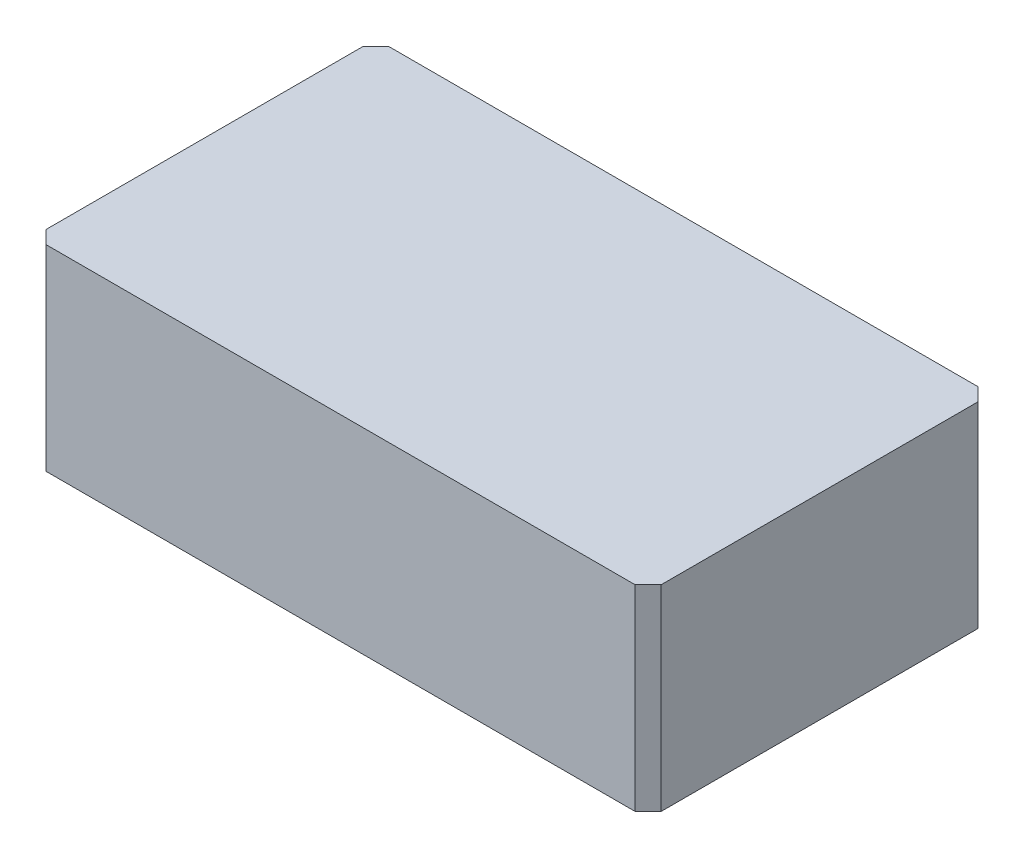
ISO-10303-21;
HEADER;
FILE_DESCRIPTION(('STEP AP214'),'2;1');
FILE_NAME('part.step','',(''),(''),'','','');
FILE_SCHEMA(('AUTOMOTIVE_DESIGN { 1 0 10303 214 1 1 1 1 }'));
ENDSEC;
DATA;
#1=APPLICATION_CONTEXT('core data for automotive mechanical design processes');
#2=APPLICATION_PROTOCOL_DEFINITION('international standard','automotive_design',2000,#1);
#3=PRODUCT_CONTEXT('',#1,'mechanical');
#4=PRODUCT('Part','Part','',(#3));
#5=PRODUCT_RELATED_PRODUCT_CATEGORY('part','',(#4));
#6=PRODUCT_DEFINITION_FORMATION('','',#4);
#7=PRODUCT_DEFINITION_CONTEXT('part definition',#1,'design');
#8=PRODUCT_DEFINITION('design','',#6,#7);
#9=PRODUCT_DEFINITION_SHAPE('','',#8);
#10=(LENGTH_UNIT() NAMED_UNIT(*) SI_UNIT(.MILLI.,.METRE.));
#11=(NAMED_UNIT(*) PLANE_ANGLE_UNIT() SI_UNIT($,.RADIAN.));
#12=(NAMED_UNIT(*) SI_UNIT($,.STERADIAN.) SOLID_ANGLE_UNIT());
#13=UNCERTAINTY_MEASURE_WITH_UNIT(LENGTH_MEASURE(1.E-05),#10,'distance_accuracy_value','');
#14=(GEOMETRIC_REPRESENTATION_CONTEXT(3) GLOBAL_UNCERTAINTY_ASSIGNED_CONTEXT((#13)) GLOBAL_UNIT_ASSIGNED_CONTEXT((#10,
#11,#12)) REPRESENTATION_CONTEXT('',''));
#15=CARTESIAN_POINT('',(0.,0.,0.));
#16=DIRECTION('',(0.,0.,1.));
#17=DIRECTION('',(1.,0.,0.));
#18=AXIS2_PLACEMENT_3D('',#15,#16,#17);
#19=CARTESIAN_POINT('',(-19.7036669970268,1.16551040634292,26.2));
#20=DIRECTION('',(1.,0.,0.));
#21=DIRECTION('',(0.,0.,-1.));
#22=AXIS2_PLACEMENT_3D('',#19,#20,#21);
#23=PLANE('',#22);
#24=DIRECTION('',(0.,0.,-1.));
#25=VECTOR('',#24,1.);
#26=CARTESIAN_POINT('',(-19.7036669970268,-13.8344895936571,26.2));
#27=LINE('',#26,#25);
#28=CARTESIAN_POINT('',(-19.7036669970268,-13.8344895936571,25.2));
#29=VERTEX_POINT('',#28);
#30=CARTESIAN_POINT('',(-19.7036669970268,-13.8344895936571,1.00000000000001));
#31=VERTEX_POINT('',#30);
#32=EDGE_CURVE('E146',#29,#31,#27,.T.);
#33=ORIENTED_EDGE('',*,*,#32,.F.);
#34=DIRECTION('',(0.,1.,0.));
#35=VECTOR('',#34,1.);
#36=CARTESIAN_POINT('',(-19.7036669970268,1.16551040634292,25.2));
#37=LINE('',#36,#35);
#38=CARTESIAN_POINT('',(-19.7036669970268,1.16551040634292,25.2));
#39=VERTEX_POINT('',#38);
#40=EDGE_CURVE('E107',#29,#39,#37,.T.);
#41=ORIENTED_EDGE('',*,*,#40,.T.);
#42=DIRECTION('',(0.,0.,-1.));
#43=VECTOR('',#42,1.);
#44=CARTESIAN_POINT('',(-19.7036669970268,1.16551040634292,26.2));
#45=LINE('',#44,#43);
#46=CARTESIAN_POINT('',(-19.7036669970268,1.16551040634292,1.00000000000001));
#47=VERTEX_POINT('',#46);
#48=EDGE_CURVE('E131',#39,#47,#45,.T.);
#49=ORIENTED_EDGE('',*,*,#48,.T.);
#50=DIRECTION('',(0.,-1.,0.));
#51=VECTOR('',#50,1.);
#52=CARTESIAN_POINT('',(-19.7036669970268,1.16551040634292,1.00000000000001));
#53=LINE('',#52,#51);
#54=EDGE_CURVE('E112',#47,#31,#53,.T.);
#55=ORIENTED_EDGE('',*,*,#54,.T.);
#56=EDGE_LOOP('',(#33,#41,#49,#55));
#57=FACE_BOUND('',#56,.T.);
#58=ADVANCED_FACE('F35',(#57),#23,.F.);
#59=CARTESIAN_POINT('',(-19.7036669970268,-13.8344895936571,26.2));
#60=DIRECTION('',(0.,1.,0.));
#61=DIRECTION('',(0.,0.,1.));
#62=AXIS2_PLACEMENT_3D('',#59,#60,#61);
#63=PLANE('',#62);
#64=DIRECTION('',(1.,0.,0.));
#65=VECTOR('',#64,1.);
#66=CARTESIAN_POINT('',(-19.7036669970268,-13.8344895936571,26.2));
#67=LINE('',#66,#65);
#68=CARTESIAN_POINT('',(-18.7036669970267,-13.8344895936571,26.2));
#69=VERTEX_POINT('',#68);
#70=CARTESIAN_POINT('',(26.2963330029732,-13.8344895936571,26.2));
#71=VERTEX_POINT('',#70);
#72=EDGE_CURVE('E120',#69,#71,#67,.T.);
#73=ORIENTED_EDGE('',*,*,#72,.F.);
#74=DIRECTION('',(-0.707106781186545,0.,-0.70710678118655));
#75=VECTOR('',#74,1.);
#76=CARTESIAN_POINT('',(-18.7036669970267,-13.8344895936571,26.2));
#77=LINE('',#76,#75);
#78=EDGE_CURVE('E102',#69,#29,#77,.T.);
#79=ORIENTED_EDGE('',*,*,#78,.T.);
#80=ORIENTED_EDGE('',*,*,#32,.T.);
#81=DIRECTION('',(-0.70710678118655,0.,0.707106781186545));
#82=VECTOR('',#81,1.);
#83=CARTESIAN_POINT('',(-19.7036669970268,-13.8344895936571,1.00000000000001));
#84=LINE('',#83,#82);
#85=CARTESIAN_POINT('',(-18.7036669970267,-13.8344895936571,0.));
#86=VERTEX_POINT('',#85);
#87=EDGE_CURVE('E113',#31,#86,#84,.F.);
#88=ORIENTED_EDGE('',*,*,#87,.T.);
#89=DIRECTION('',(1.,0.,0.));
#90=VECTOR('',#89,1.);
#91=CARTESIAN_POINT('',(-19.7036669970268,-13.8344895936571,0.));
#92=LINE('',#91,#90);
#93=CARTESIAN_POINT('',(26.2963330029732,-13.8344895936571,0.));
#94=VERTEX_POINT('',#93);
#95=EDGE_CURVE('E134',#86,#94,#92,.T.);
#96=ORIENTED_EDGE('',*,*,#95,.T.);
#97=DIRECTION('',(-0.70710678118655,0.,-0.707106781186545));
#98=VECTOR('',#97,1.);
#99=CARTESIAN_POINT('',(27.2963330029732,-13.8344895936571,1.00000000000001));
#100=LINE('',#99,#98);
#101=CARTESIAN_POINT('',(27.2963330029732,-13.8344895936571,1.00000000000001));
#102=VERTEX_POINT('',#101);
#103=EDGE_CURVE('E150',#94,#102,#100,.F.);
#104=ORIENTED_EDGE('',*,*,#103,.T.);
#105=DIRECTION('',(0.,0.,-1.));
#106=VECTOR('',#105,1.);
#107=CARTESIAN_POINT('',(27.2963330029732,-13.8344895936571,26.2));
#108=LINE('',#107,#106);
#109=CARTESIAN_POINT('',(27.2963330029732,-13.8344895936571,25.2));
#110=VERTEX_POINT('',#109);
#111=EDGE_CURVE('E143',#110,#102,#108,.T.);
#112=ORIENTED_EDGE('',*,*,#111,.F.);
#113=DIRECTION('',(-0.707106781186545,0.,0.70710678118655));
#114=VECTOR('',#113,1.);
#115=CARTESIAN_POINT('',(26.2963330029732,-13.8344895936571,26.2));
#116=LINE('',#115,#114);
#117=EDGE_CURVE('E123',#110,#71,#116,.T.);
#118=ORIENTED_EDGE('',*,*,#117,.T.);
#119=EDGE_LOOP('',(#73,#79,#80,#88,#96,#104,#112,#118));
#120=FACE_BOUND('',#119,.T.);
#121=ADVANCED_FACE('F126',(#120),#63,.F.);
#122=CARTESIAN_POINT('',(27.2963330029732,1.16551040634292,26.2));
#123=DIRECTION('',(-1.,0.,0.));
#124=DIRECTION('',(0.,0.,1.));
#125=AXIS2_PLACEMENT_3D('',#122,#123,#124);
#126=PLANE('',#125);
#127=ORIENTED_EDGE('',*,*,#111,.T.);
#128=DIRECTION('',(0.,1.,0.));
#129=VECTOR('',#128,1.);
#130=CARTESIAN_POINT('',(27.2963330029732,1.16551040634292,1.00000000000001));
#131=LINE('',#130,#129);
#132=CARTESIAN_POINT('',(27.2963330029732,1.16551040634292,1.00000000000001));
#133=VERTEX_POINT('',#132);
#134=EDGE_CURVE('E11',#102,#133,#131,.T.);
#135=ORIENTED_EDGE('',*,*,#134,.T.);
#136=DIRECTION('',(0.,0.,-1.));
#137=VECTOR('',#136,1.);
#138=CARTESIAN_POINT('',(27.2963330029732,1.16551040634292,26.2));
#139=LINE('',#138,#137);
#140=CARTESIAN_POINT('',(27.2963330029732,1.16551040634292,25.2));
#141=VERTEX_POINT('',#140);
#142=EDGE_CURVE('E141',#141,#133,#139,.T.);
#143=ORIENTED_EDGE('',*,*,#142,.F.);
#144=DIRECTION('',(0.,-1.,0.));
#145=VECTOR('',#144,1.);
#146=CARTESIAN_POINT('',(27.2963330029732,-13.8344895936571,25.2));
#147=LINE('',#146,#145);
#148=EDGE_CURVE('E44',#141,#110,#147,.T.);
#149=ORIENTED_EDGE('',*,*,#148,.T.);
#150=EDGE_LOOP('',(#127,#135,#143,#149));
#151=FACE_BOUND('',#150,.T.);
#152=ADVANCED_FACE('F167',(#151),#126,.F.);
#153=CARTESIAN_POINT('',(-19.7036669970268,1.16551040634292,26.2));
#154=DIRECTION('',(0.,-1.,0.));
#155=DIRECTION('',(0.,0.,-1.));
#156=AXIS2_PLACEMENT_3D('',#153,#154,#155);
#157=PLANE('',#156);
#158=ORIENTED_EDGE('',*,*,#48,.F.);
#159=DIRECTION('',(0.707106781186545,0.,0.70710678118655));
#160=VECTOR('',#159,1.);
#161=CARTESIAN_POINT('',(-18.7036669970267,1.16551040634292,26.2));
#162=LINE('',#161,#160);
#163=CARTESIAN_POINT('',(-18.7036669970267,1.16551040634292,26.2));
#164=VERTEX_POINT('',#163);
#165=EDGE_CURVE('E160',#39,#164,#162,.T.);
#166=ORIENTED_EDGE('',*,*,#165,.T.);
#167=DIRECTION('',(-1.,0.,0.));
#168=VECTOR('',#167,1.);
#169=CARTESIAN_POINT('',(-19.7036669970268,1.16551040634292,26.2));
#170=LINE('',#169,#168);
#171=CARTESIAN_POINT('',(26.2963330029732,1.16551040634292,26.2));
#172=VERTEX_POINT('',#171);
#173=EDGE_CURVE('E122',#172,#164,#170,.T.);
#174=ORIENTED_EDGE('',*,*,#173,.F.);
#175=DIRECTION('',(0.707106781186545,0.,-0.70710678118655));
#176=VECTOR('',#175,1.);
#177=CARTESIAN_POINT('',(26.2963330029732,1.16551040634292,26.2));
#178=LINE('',#177,#176);
#179=EDGE_CURVE('E58',#172,#141,#178,.T.);
#180=ORIENTED_EDGE('',*,*,#179,.T.);
#181=ORIENTED_EDGE('',*,*,#142,.T.);
#182=DIRECTION('',(0.70710678118655,0.,0.707106781186545));
#183=VECTOR('',#182,1.);
#184=CARTESIAN_POINT('',(27.2963330029732,1.16551040634292,1.00000000000001));
#185=LINE('',#184,#183);
#186=CARTESIAN_POINT('',(26.2963330029732,1.16551040634292,0.));
#187=VERTEX_POINT('',#186);
#188=EDGE_CURVE('E51',#133,#187,#185,.F.);
#189=ORIENTED_EDGE('',*,*,#188,.T.);
#190=DIRECTION('',(-1.,0.,0.));
#191=VECTOR('',#190,1.);
#192=CARTESIAN_POINT('',(-19.7036669970268,1.16551040634292,0.));
#193=LINE('',#192,#191);
#194=CARTESIAN_POINT('',(-18.7036669970267,1.16551040634292,0.));
#195=VERTEX_POINT('',#194);
#196=EDGE_CURVE('E129',#187,#195,#193,.T.);
#197=ORIENTED_EDGE('',*,*,#196,.T.);
#198=DIRECTION('',(0.70710678118655,0.,-0.707106781186545));
#199=VECTOR('',#198,1.);
#200=CARTESIAN_POINT('',(-19.7036669970268,1.16551040634292,1.00000000000001));
#201=LINE('',#200,#199);
#202=EDGE_CURVE('E158',#195,#47,#201,.F.);
#203=ORIENTED_EDGE('',*,*,#202,.T.);
#204=EDGE_LOOP('',(#158,#166,#174,#180,#181,#189,#197,#203));
#205=FACE_BOUND('',#204,.T.);
#206=ADVANCED_FACE('F171',(#205),#157,.F.);
#207=CARTESIAN_POINT('',(0.,0.,26.2));
#208=DIRECTION('',(0.,0.,1.));
#209=DIRECTION('',(1.,0.,0.));
#210=AXIS2_PLACEMENT_3D('',#207,#208,#209);
#211=PLANE('',#210);
#212=ORIENTED_EDGE('',*,*,#173,.T.);
#213=DIRECTION('',(0.,-1.,0.));
#214=VECTOR('',#213,1.);
#215=CARTESIAN_POINT('',(-18.7036669970267,-13.8344895936571,26.2));
#216=LINE('',#215,#214);
#217=EDGE_CURVE('E106',#164,#69,#216,.T.);
#218=ORIENTED_EDGE('',*,*,#217,.T.);
#219=ORIENTED_EDGE('',*,*,#72,.T.);
#220=DIRECTION('',(0.,1.,0.));
#221=VECTOR('',#220,1.);
#222=CARTESIAN_POINT('',(26.2963330029732,1.16551040634292,26.2));
#223=LINE('',#222,#221);
#224=EDGE_CURVE('E124',#71,#172,#223,.T.);
#225=ORIENTED_EDGE('',*,*,#224,.T.);
#226=EDGE_LOOP('',(#212,#218,#219,#225));
#227=FACE_BOUND('',#226,.T.);
#228=ADVANCED_FACE('F118',(#227),#211,.T.);
#229=CARTESIAN_POINT('',(0.,0.,0.));
#230=DIRECTION('',(0.,0.,1.));
#231=DIRECTION('',(1.,0.,0.));
#232=AXIS2_PLACEMENT_3D('',#229,#230,#231);
#233=PLANE('',#232);
#234=ORIENTED_EDGE('',*,*,#95,.F.);
#235=DIRECTION('',(0.,1.,0.));
#236=VECTOR('',#235,1.);
#237=CARTESIAN_POINT('',(-18.7036669970267,0.,0.));
#238=LINE('',#237,#236);
#239=EDGE_CURVE('E164',#86,#195,#238,.T.);
#240=ORIENTED_EDGE('',*,*,#239,.T.);
#241=ORIENTED_EDGE('',*,*,#196,.F.);
#242=DIRECTION('',(0.,-1.,0.));
#243=VECTOR('',#242,1.);
#244=CARTESIAN_POINT('',(26.2963330029732,0.,0.));
#245=LINE('',#244,#243);
#246=EDGE_CURVE('E162',#187,#94,#245,.T.);
#247=ORIENTED_EDGE('',*,*,#246,.T.);
#248=EDGE_LOOP('',(#234,#240,#241,#247));
#249=FACE_BOUND('',#248,.T.);
#250=ADVANCED_FACE('F180',(#249),#233,.F.);
#251=CARTESIAN_POINT('',(-18.7036669970267,0.,26.2));
#252=DIRECTION('',(-0.70710678118655,0.,0.707106781186545));
#253=DIRECTION('',(0.,1.,0.));
#254=AXIS2_PLACEMENT_3D('',#251,#252,#253);
#255=PLANE('',#254);
#256=ORIENTED_EDGE('',*,*,#165,.F.);
#257=ORIENTED_EDGE('',*,*,#40,.F.);
#258=ORIENTED_EDGE('',*,*,#78,.F.);
#259=ORIENTED_EDGE('',*,*,#217,.F.);
#260=EDGE_LOOP('',(#256,#257,#258,#259));
#261=FACE_BOUND('',#260,.T.);
#262=ADVANCED_FACE('F105',(#261),#255,.T.);
#263=CARTESIAN_POINT('',(-19.7036669970268,1.16551040634292,1.00000000000001));
#264=DIRECTION('',(0.707106781186545,0.,0.70710678118655));
#265=DIRECTION('',(0.,-1.,0.));
#266=AXIS2_PLACEMENT_3D('',#263,#264,#265);
#267=PLANE('',#266);
#268=ORIENTED_EDGE('',*,*,#202,.F.);
#269=ORIENTED_EDGE('',*,*,#239,.F.);
#270=ORIENTED_EDGE('',*,*,#87,.F.);
#271=ORIENTED_EDGE('',*,*,#54,.F.);
#272=EDGE_LOOP('',(#268,#269,#270,#271));
#273=FACE_BOUND('',#272,.T.);
#274=ADVANCED_FACE('F176',(#273),#267,.F.);
#275=CARTESIAN_POINT('',(27.2963330029732,1.16551040634292,1.00000000000001));
#276=DIRECTION('',(-0.707106781186545,0.,0.70710678118655));
#277=DIRECTION('',(0.,1.,0.));
#278=AXIS2_PLACEMENT_3D('',#275,#276,#277);
#279=PLANE('',#278);
#280=ORIENTED_EDGE('',*,*,#103,.F.);
#281=ORIENTED_EDGE('',*,*,#246,.F.);
#282=ORIENTED_EDGE('',*,*,#188,.F.);
#283=ORIENTED_EDGE('',*,*,#134,.F.);
#284=EDGE_LOOP('',(#280,#281,#282,#283));
#285=FACE_BOUND('',#284,.T.);
#286=ADVANCED_FACE('F182',(#285),#279,.F.);
#287=CARTESIAN_POINT('',(26.2963330029732,0.,26.2));
#288=DIRECTION('',(0.70710678118655,0.,0.707106781186545));
#289=DIRECTION('',(0.,-1.,0.));
#290=AXIS2_PLACEMENT_3D('',#287,#288,#289);
#291=PLANE('',#290);
#292=ORIENTED_EDGE('',*,*,#117,.F.);
#293=ORIENTED_EDGE('',*,*,#148,.F.);
#294=ORIENTED_EDGE('',*,*,#179,.F.);
#295=ORIENTED_EDGE('',*,*,#224,.F.);
#296=EDGE_LOOP('',(#292,#293,#294,#295));
#297=FACE_BOUND('',#296,.T.);
#298=ADVANCED_FACE('F38',(#297),#291,.T.);
#299=CLOSED_SHELL('',(#58,#121,#152,#206,#228,#250,#262,#274,#286,#298));
#300=MANIFOLD_SOLID_BREP('B2',#299);
#301=ADVANCED_BREP_SHAPE_REPRESENTATION('',(#18,#300),#14);
#302=SHAPE_DEFINITION_REPRESENTATION(#9,#301);
ENDSEC;
END-ISO-10303-21;
